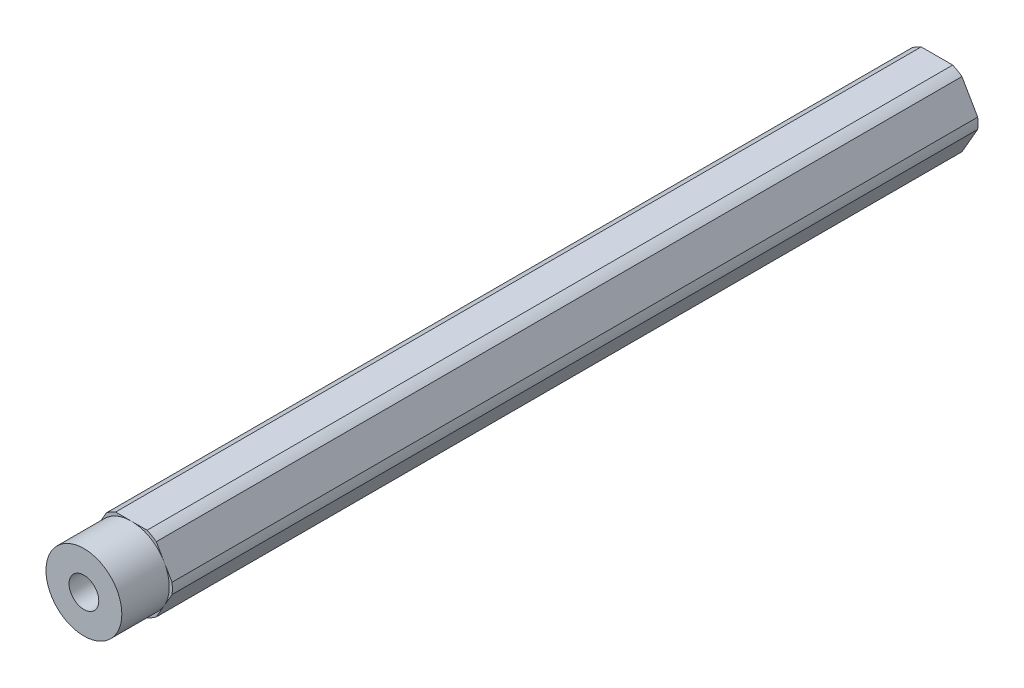
ISO-10303-21;
HEADER;
FILE_DESCRIPTION(('STEP AP214'),'2;1');
FILE_NAME('part.step','',(''),(''),'','','');
FILE_SCHEMA(('AUTOMOTIVE_DESIGN { 1 0 10303 214 1 1 1 1 }'));
ENDSEC;
DATA;
#1=APPLICATION_CONTEXT('core data for automotive mechanical design processes');
#2=APPLICATION_PROTOCOL_DEFINITION('international standard','automotive_design',2000,#1);
#3=PRODUCT_CONTEXT('',#1,'mechanical');
#4=PRODUCT('Part','Part','',(#3));
#5=PRODUCT_RELATED_PRODUCT_CATEGORY('part','',(#4));
#6=PRODUCT_DEFINITION_FORMATION('','',#4);
#7=PRODUCT_DEFINITION_CONTEXT('part definition',#1,'design');
#8=PRODUCT_DEFINITION('design','',#6,#7);
#9=PRODUCT_DEFINITION_SHAPE('','',#8);
#10=(LENGTH_UNIT() NAMED_UNIT(*) SI_UNIT(.MILLI.,.METRE.));
#11=(NAMED_UNIT(*) PLANE_ANGLE_UNIT() SI_UNIT($,.RADIAN.));
#12=(NAMED_UNIT(*) SI_UNIT($,.STERADIAN.) SOLID_ANGLE_UNIT());
#13=UNCERTAINTY_MEASURE_WITH_UNIT(LENGTH_MEASURE(1.E-05),#10,'distance_accuracy_value','');
#14=(GEOMETRIC_REPRESENTATION_CONTEXT(3) GLOBAL_UNCERTAINTY_ASSIGNED_CONTEXT((#13)) GLOBAL_UNIT_ASSIGNED_CONTEXT((#10,
#11,#12)) REPRESENTATION_CONTEXT('',''));
#15=CARTESIAN_POINT('',(0.,0.,0.));
#16=DIRECTION('',(0.,0.,1.));
#17=DIRECTION('',(1.,0.,0.));
#18=AXIS2_PLACEMENT_3D('',#15,#16,#17);
#19=CARTESIAN_POINT('',(0.,0.,67.44335));
#20=DIRECTION('',(0.,0.,1.));
#21=DIRECTION('',(1.,0.,0.));
#22=AXIS2_PLACEMENT_3D('',#19,#20,#21);
#23=PLANE('',#22);
#24=CARTESIAN_POINT('',(0.,0.,67.44335));
#25=DIRECTION('',(0.,0.,1.));
#26=DIRECTION('',(1.,0.,0.));
#27=AXIS2_PLACEMENT_3D('',#24,#25,#26);
#28=CIRCLE('',#27,6.35);
#29=CARTESIAN_POINT('',(5.49926131403118,3.175,67.44335));
#30=VERTEX_POINT('',#29);
#31=CARTESIAN_POINT('',(0.,6.35,67.44335));
#32=VERTEX_POINT('',#31);
#33=EDGE_CURVE('E54',#30,#32,#28,.T.);
#34=ORIENTED_EDGE('',*,*,#33,.F.);
#35=DIRECTION('',(-0.5,0.866025403784439,0.));
#36=VECTOR('',#35,1.);
#37=CARTESIAN_POINT('',(5.49926131403118,3.175,67.44335));
#38=LINE('',#37,#36);
#39=CARTESIAN_POINT('',(4.18177084608654,5.45696042896782,67.44335));
#40=VERTEX_POINT('',#39);
#41=EDGE_CURVE('E161',#30,#40,#38,.T.);
#42=ORIENTED_EDGE('',*,*,#41,.T.);
#43=CARTESIAN_POINT('',(0.,0.,67.44335));
#44=DIRECTION('',(0.,0.,1.));
#45=DIRECTION('',(1.,0.,0.));
#46=AXIS2_PLACEMENT_3D('',#43,#44,#45);
#47=CIRCLE('',#46,6.874999966);
#48=CARTESIAN_POINT('',(2.63498093588929,6.35,67.44335));
#49=VERTEX_POINT('',#48);
#50=EDGE_CURVE('E160',#40,#49,#47,.T.);
#51=ORIENTED_EDGE('',*,*,#50,.T.);
#52=DIRECTION('',(-1.,0.,0.));
#53=VECTOR('',#52,1.);
#54=CARTESIAN_POINT('',(0.,6.35,67.44335));
#55=LINE('',#54,#53);
#56=EDGE_CURVE('E174',#49,#32,#55,.T.);
#57=ORIENTED_EDGE('',*,*,#56,.T.);
#58=EDGE_LOOP('',(#34,#42,#51,#57));
#59=FACE_BOUND('',#58,.T.);
#60=ADVANCED_FACE('F43',(#59),#23,.T.);
#61=CARTESIAN_POINT('',(-5.49926131403118,3.175,67.44335));
#62=VERTEX_POINT('',#61);
#63=EDGE_CURVE('E11',#32,#62,#28,.T.);
#64=ORIENTED_EDGE('',*,*,#63,.F.);
#65=CARTESIAN_POINT('',(-2.63498093588929,6.35,67.44335));
#66=VERTEX_POINT('',#65);
#67=EDGE_CURVE('E186',#32,#66,#55,.T.);
#68=ORIENTED_EDGE('',*,*,#67,.T.);
#69=CARTESIAN_POINT('',(-4.18177084608654,5.45696042896783,67.44335));
#70=VERTEX_POINT('',#69);
#71=EDGE_CURVE('E187',#66,#70,#47,.T.);
#72=ORIENTED_EDGE('',*,*,#71,.T.);
#73=DIRECTION('',(-0.5,-0.866025403784438,0.));
#74=VECTOR('',#73,1.);
#75=CARTESIAN_POINT('',(-5.49926131403118,3.175,67.44335));
#76=LINE('',#75,#74);
#77=EDGE_CURVE('E189',#70,#62,#76,.T.);
#78=ORIENTED_EDGE('',*,*,#77,.T.);
#79=EDGE_LOOP('',(#64,#68,#72,#78));
#80=FACE_BOUND('',#79,.T.);
#81=ADVANCED_FACE('F310',(#80),#23,.T.);
#82=CARTESIAN_POINT('',(-5.49926131403118,-3.175,67.44335));
#83=VERTEX_POINT('',#82);
#84=EDGE_CURVE('E52',#62,#83,#28,.T.);
#85=ORIENTED_EDGE('',*,*,#84,.F.);
#86=CARTESIAN_POINT('',(-6.81675178197583,0.893039571032178,67.44335));
#87=VERTEX_POINT('',#86);
#88=EDGE_CURVE('E193',#62,#87,#76,.T.);
#89=ORIENTED_EDGE('',*,*,#88,.T.);
#90=CARTESIAN_POINT('',(-6.81675178197583,-0.893039571032174,67.44335));
#91=VERTEX_POINT('',#90);
#92=EDGE_CURVE('E192',#87,#91,#47,.T.);
#93=ORIENTED_EDGE('',*,*,#92,.T.);
#94=DIRECTION('',(0.5,-0.866025403784438,0.));
#95=VECTOR('',#94,1.);
#96=CARTESIAN_POINT('',(-5.49926131403118,-3.175,67.44335));
#97=LINE('',#96,#95);
#98=EDGE_CURVE('E194',#91,#83,#97,.T.);
#99=ORIENTED_EDGE('',*,*,#98,.T.);
#100=EDGE_LOOP('',(#85,#89,#93,#99));
#101=FACE_BOUND('',#100,.T.);
#102=ADVANCED_FACE('F298',(#101),#23,.T.);
#103=CARTESIAN_POINT('',(0.,-6.35,67.44335));
#104=VERTEX_POINT('',#103);
#105=EDGE_CURVE('E180',#83,#104,#28,.T.);
#106=ORIENTED_EDGE('',*,*,#105,.F.);
#107=CARTESIAN_POINT('',(-4.18177084608653,-5.45696042896783,67.44335));
#108=VERTEX_POINT('',#107);
#109=EDGE_CURVE('E198',#83,#108,#97,.T.);
#110=ORIENTED_EDGE('',*,*,#109,.T.);
#111=CARTESIAN_POINT('',(-2.6349809358893,-6.35,67.44335));
#112=VERTEX_POINT('',#111);
#113=EDGE_CURVE('E197',#108,#112,#47,.T.);
#114=ORIENTED_EDGE('',*,*,#113,.T.);
#115=DIRECTION('',(1.,0.,0.));
#116=VECTOR('',#115,1.);
#117=CARTESIAN_POINT('',(0.,-6.35,67.44335));
#118=LINE('',#117,#116);
#119=EDGE_CURVE('E199',#112,#104,#118,.T.);
#120=ORIENTED_EDGE('',*,*,#119,.T.);
#121=EDGE_LOOP('',(#106,#110,#114,#120));
#122=FACE_BOUND('',#121,.T.);
#123=ADVANCED_FACE('F356',(#122),#23,.T.);
#124=CARTESIAN_POINT('',(5.49926131403119,-3.175,67.44335));
#125=VERTEX_POINT('',#124);
#126=EDGE_CURVE('E69',#104,#125,#28,.T.);
#127=ORIENTED_EDGE('',*,*,#126,.F.);
#128=CARTESIAN_POINT('',(2.6349809358893,-6.35,67.44335));
#129=VERTEX_POINT('',#128);
#130=EDGE_CURVE('E203',#104,#129,#118,.T.);
#131=ORIENTED_EDGE('',*,*,#130,.T.);
#132=CARTESIAN_POINT('',(4.18177084608654,-5.45696042896782,67.44335));
#133=VERTEX_POINT('',#132);
#134=EDGE_CURVE('E202',#129,#133,#47,.T.);
#135=ORIENTED_EDGE('',*,*,#134,.T.);
#136=DIRECTION('',(0.5,0.866025403784439,0.));
#137=VECTOR('',#136,1.);
#138=CARTESIAN_POINT('',(5.49926131403119,-3.175,67.44335));
#139=LINE('',#138,#137);
#140=EDGE_CURVE('E204',#133,#125,#139,.T.);
#141=ORIENTED_EDGE('',*,*,#140,.T.);
#142=EDGE_LOOP('',(#127,#131,#135,#141));
#143=FACE_BOUND('',#142,.T.);
#144=ADVANCED_FACE('F343',(#143),#23,.T.);
#145=CARTESIAN_POINT('',(5.49926131403118,3.175,67.44335));
#146=DIRECTION('',(-0.866025403784438,-0.5,0.));
#147=DIRECTION('',(0.5,-0.866025403784439,0.));
#148=AXIS2_PLACEMENT_3D('',#145,#146,#147);
#149=PLANE('',#148);
#150=DIRECTION('',(-0.5,0.866025403784439,0.));
#151=VECTOR('',#150,1.);
#152=CARTESIAN_POINT('',(5.49926131403118,3.175,-67.44335));
#153=LINE('',#152,#151);
#154=CARTESIAN_POINT('',(6.81675178197583,0.89303957103218,-67.44335));
#155=VERTEX_POINT('',#154);
#156=CARTESIAN_POINT('',(4.18177084608654,5.45696042896782,-67.44335));
#157=VERTEX_POINT('',#156);
#158=EDGE_CURVE('E207',#155,#157,#153,.T.);
#159=ORIENTED_EDGE('',*,*,#158,.T.);
#160=DIRECTION('',(0.,0.,-1.));
#161=VECTOR('',#160,1.);
#162=CARTESIAN_POINT('',(4.18177084608654,5.45696042896782,67.44335));
#163=LINE('',#162,#161);
#164=EDGE_CURVE('E167',#40,#157,#163,.T.);
#165=ORIENTED_EDGE('',*,*,#164,.F.);
#166=ORIENTED_EDGE('',*,*,#41,.F.);
#167=CARTESIAN_POINT('',(6.81675178197583,0.89303957103218,67.44335));
#168=VERTEX_POINT('',#167);
#169=EDGE_CURVE('E152',#168,#30,#38,.T.);
#170=ORIENTED_EDGE('',*,*,#169,.F.);
#171=DIRECTION('',(0.,0.,-1.));
#172=VECTOR('',#171,1.);
#173=CARTESIAN_POINT('',(6.81675178197583,0.89303957103218,67.44335));
#174=LINE('',#173,#172);
#175=EDGE_CURVE('E225',#168,#155,#174,.T.);
#176=ORIENTED_EDGE('',*,*,#175,.T.);
#177=EDGE_LOOP('',(#159,#165,#166,#170,#176));
#178=FACE_BOUND('',#177,.T.);
#179=ADVANCED_FACE('F45',(#178),#149,.F.);
#180=CARTESIAN_POINT('',(0.,0.,67.44335));
#181=DIRECTION('',(0.,0.,-1.));
#182=DIRECTION('',(-1.,0.,0.));
#183=AXIS2_PLACEMENT_3D('',#180,#181,#182);
#184=CYLINDRICAL_SURFACE('',#183,6.874999966);
#185=CARTESIAN_POINT('',(0.,0.,-67.44335));
#186=DIRECTION('',(0.,0.,1.));
#187=DIRECTION('',(1.,0.,0.));
#188=AXIS2_PLACEMENT_3D('',#185,#186,#187);
#189=CIRCLE('',#188,6.874999966);
#190=CARTESIAN_POINT('',(2.63498093588929,6.35,-67.44335));
#191=VERTEX_POINT('',#190);
#192=EDGE_CURVE('E209',#157,#191,#189,.T.);
#193=ORIENTED_EDGE('',*,*,#192,.T.);
#194=DIRECTION('',(0.,0.,-1.));
#195=VECTOR('',#194,1.);
#196=CARTESIAN_POINT('',(2.63498093588929,6.35,67.44335));
#197=LINE('',#196,#195);
#198=EDGE_CURVE('E181',#49,#191,#197,.T.);
#199=ORIENTED_EDGE('',*,*,#198,.F.);
#200=ORIENTED_EDGE('',*,*,#50,.F.);
#201=ORIENTED_EDGE('',*,*,#164,.T.);
#202=EDGE_LOOP('',(#193,#199,#200,#201));
#203=FACE_BOUND('',#202,.T.);
#204=ADVANCED_FACE('F314',(#203),#184,.T.);
#205=CARTESIAN_POINT('',(0.,6.35,67.44335));
#206=DIRECTION('',(0.,-1.,0.));
#207=DIRECTION('',(0.,0.,-1.));
#208=AXIS2_PLACEMENT_3D('',#205,#206,#207);
#209=PLANE('',#208);
#210=DIRECTION('',(-1.,0.,0.));
#211=VECTOR('',#210,1.);
#212=CARTESIAN_POINT('',(0.,6.35,-67.44335));
#213=LINE('',#212,#211);
#214=CARTESIAN_POINT('',(-2.63498093588929,6.35,-67.44335));
#215=VERTEX_POINT('',#214);
#216=EDGE_CURVE('E211',#191,#215,#213,.T.);
#217=ORIENTED_EDGE('',*,*,#216,.T.);
#218=DIRECTION('',(0.,0.,-1.));
#219=VECTOR('',#218,1.);
#220=CARTESIAN_POINT('',(-2.63498093588929,6.35,67.44335));
#221=LINE('',#220,#219);
#222=EDGE_CURVE('E251',#66,#215,#221,.T.);
#223=ORIENTED_EDGE('',*,*,#222,.F.);
#224=ORIENTED_EDGE('',*,*,#67,.F.);
#225=ORIENTED_EDGE('',*,*,#56,.F.);
#226=ORIENTED_EDGE('',*,*,#198,.T.);
#227=EDGE_LOOP('',(#217,#223,#224,#225,#226));
#228=FACE_BOUND('',#227,.T.);
#229=ADVANCED_FACE('F258',(#228),#209,.F.);
#230=CARTESIAN_POINT('',(-4.18177084608654,5.45696042896783,-67.44335));
#231=VERTEX_POINT('',#230);
#232=EDGE_CURVE('E212',#215,#231,#189,.T.);
#233=ORIENTED_EDGE('',*,*,#232,.T.);
#234=DIRECTION('',(0.,0.,-1.));
#235=VECTOR('',#234,1.);
#236=CARTESIAN_POINT('',(-4.18177084608654,5.45696042896783,67.44335));
#237=LINE('',#236,#235);
#238=EDGE_CURVE('E248',#70,#231,#237,.T.);
#239=ORIENTED_EDGE('',*,*,#238,.F.);
#240=ORIENTED_EDGE('',*,*,#71,.F.);
#241=ORIENTED_EDGE('',*,*,#222,.T.);
#242=EDGE_LOOP('',(#233,#239,#240,#241));
#243=FACE_BOUND('',#242,.T.);
#244=ADVANCED_FACE('F311',(#243),#184,.T.);
#245=CARTESIAN_POINT('',(-5.49926131403118,3.175,67.44335));
#246=DIRECTION('',(0.866025403784438,-0.5,0.));
#247=DIRECTION('',(0.5,0.866025403784439,0.));
#248=AXIS2_PLACEMENT_3D('',#245,#246,#247);
#249=PLANE('',#248);
#250=DIRECTION('',(-0.5,-0.866025403784438,0.));
#251=VECTOR('',#250,1.);
#252=CARTESIAN_POINT('',(-5.49926131403118,3.175,-67.44335));
#253=LINE('',#252,#251);
#254=CARTESIAN_POINT('',(-6.81675178197583,0.893039571032178,-67.44335));
#255=VERTEX_POINT('',#254);
#256=EDGE_CURVE('E214',#231,#255,#253,.T.);
#257=ORIENTED_EDGE('',*,*,#256,.T.);
#258=DIRECTION('',(0.,0.,-1.));
#259=VECTOR('',#258,1.);
#260=CARTESIAN_POINT('',(-6.81675178197583,0.893039571032178,67.44335));
#261=LINE('',#260,#259);
#262=EDGE_CURVE('E245',#87,#255,#261,.T.);
#263=ORIENTED_EDGE('',*,*,#262,.F.);
#264=ORIENTED_EDGE('',*,*,#88,.F.);
#265=ORIENTED_EDGE('',*,*,#77,.F.);
#266=ORIENTED_EDGE('',*,*,#238,.T.);
#267=EDGE_LOOP('',(#257,#263,#264,#265,#266));
#268=FACE_BOUND('',#267,.T.);
#269=ADVANCED_FACE('F302',(#268),#249,.F.);
#270=CARTESIAN_POINT('',(-6.81675178197583,-0.893039571032174,-67.44335));
#271=VERTEX_POINT('',#270);
#272=EDGE_CURVE('E216',#255,#271,#189,.T.);
#273=ORIENTED_EDGE('',*,*,#272,.T.);
#274=DIRECTION('',(0.,0.,-1.));
#275=VECTOR('',#274,1.);
#276=CARTESIAN_POINT('',(-6.81675178197583,-0.893039571032174,67.44335));
#277=LINE('',#276,#275);
#278=EDGE_CURVE('E242',#91,#271,#277,.T.);
#279=ORIENTED_EDGE('',*,*,#278,.F.);
#280=ORIENTED_EDGE('',*,*,#92,.F.);
#281=ORIENTED_EDGE('',*,*,#262,.T.);
#282=EDGE_LOOP('',(#273,#279,#280,#281));
#283=FACE_BOUND('',#282,.T.);
#284=ADVANCED_FACE('F303',(#283),#184,.T.);
#285=CARTESIAN_POINT('',(-5.49926131403118,-3.175,67.44335));
#286=DIRECTION('',(0.866025403784438,0.5,0.));
#287=DIRECTION('',(-0.5,0.866025403784439,0.));
#288=AXIS2_PLACEMENT_3D('',#285,#286,#287);
#289=PLANE('',#288);
#290=DIRECTION('',(0.5,-0.866025403784438,0.));
#291=VECTOR('',#290,1.);
#292=CARTESIAN_POINT('',(-5.49926131403118,-3.175,-67.44335));
#293=LINE('',#292,#291);
#294=CARTESIAN_POINT('',(-4.18177084608653,-5.45696042896783,-67.44335));
#295=VERTEX_POINT('',#294);
#296=EDGE_CURVE('E217',#271,#295,#293,.T.);
#297=ORIENTED_EDGE('',*,*,#296,.T.);
#298=DIRECTION('',(0.,0.,-1.));
#299=VECTOR('',#298,1.);
#300=CARTESIAN_POINT('',(-4.18177084608653,-5.45696042896783,67.44335));
#301=LINE('',#300,#299);
#302=EDGE_CURVE('E239',#108,#295,#301,.T.);
#303=ORIENTED_EDGE('',*,*,#302,.F.);
#304=ORIENTED_EDGE('',*,*,#109,.F.);
#305=ORIENTED_EDGE('',*,*,#98,.F.);
#306=ORIENTED_EDGE('',*,*,#278,.T.);
#307=EDGE_LOOP('',(#297,#303,#304,#305,#306));
#308=FACE_BOUND('',#307,.T.);
#309=ADVANCED_FACE('F308',(#308),#289,.F.);
#310=CARTESIAN_POINT('',(-2.6349809358893,-6.35,-67.44335));
#311=VERTEX_POINT('',#310);
#312=EDGE_CURVE('E219',#295,#311,#189,.T.);
#313=ORIENTED_EDGE('',*,*,#312,.T.);
#314=DIRECTION('',(0.,0.,-1.));
#315=VECTOR('',#314,1.);
#316=CARTESIAN_POINT('',(-2.6349809358893,-6.35,67.44335));
#317=LINE('',#316,#315);
#318=EDGE_CURVE('E236',#112,#311,#317,.T.);
#319=ORIENTED_EDGE('',*,*,#318,.F.);
#320=ORIENTED_EDGE('',*,*,#113,.F.);
#321=ORIENTED_EDGE('',*,*,#302,.T.);
#322=EDGE_LOOP('',(#313,#319,#320,#321));
#323=FACE_BOUND('',#322,.T.);
#324=ADVANCED_FACE('F323',(#323),#184,.T.);
#325=CARTESIAN_POINT('',(0.,-6.35,67.44335));
#326=DIRECTION('',(0.,1.,0.));
#327=DIRECTION('',(0.,0.,1.));
#328=AXIS2_PLACEMENT_3D('',#325,#326,#327);
#329=PLANE('',#328);
#330=DIRECTION('',(1.,0.,0.));
#331=VECTOR('',#330,1.);
#332=CARTESIAN_POINT('',(0.,-6.35,-67.44335));
#333=LINE('',#332,#331);
#334=CARTESIAN_POINT('',(2.6349809358893,-6.35,-67.44335));
#335=VERTEX_POINT('',#334);
#336=EDGE_CURVE('E220',#311,#335,#333,.T.);
#337=ORIENTED_EDGE('',*,*,#336,.T.);
#338=DIRECTION('',(0.,0.,-1.));
#339=VECTOR('',#338,1.);
#340=CARTESIAN_POINT('',(2.6349809358893,-6.35,67.44335));
#341=LINE('',#340,#339);
#342=EDGE_CURVE('E233',#129,#335,#341,.T.);
#343=ORIENTED_EDGE('',*,*,#342,.F.);
#344=ORIENTED_EDGE('',*,*,#130,.F.);
#345=ORIENTED_EDGE('',*,*,#119,.F.);
#346=ORIENTED_EDGE('',*,*,#318,.T.);
#347=EDGE_LOOP('',(#337,#343,#344,#345,#346));
#348=FACE_BOUND('',#347,.T.);
#349=ADVANCED_FACE('F366',(#348),#329,.F.);
#350=CARTESIAN_POINT('',(4.18177084608654,-5.45696042896782,-67.44335));
#351=VERTEX_POINT('',#350);
#352=EDGE_CURVE('E222',#335,#351,#189,.T.);
#353=ORIENTED_EDGE('',*,*,#352,.T.);
#354=DIRECTION('',(0.,0.,-1.));
#355=VECTOR('',#354,1.);
#356=CARTESIAN_POINT('',(4.18177084608654,-5.45696042896782,67.44335));
#357=LINE('',#356,#355);
#358=EDGE_CURVE('E230',#133,#351,#357,.T.);
#359=ORIENTED_EDGE('',*,*,#358,.F.);
#360=ORIENTED_EDGE('',*,*,#134,.F.);
#361=ORIENTED_EDGE('',*,*,#342,.T.);
#362=EDGE_LOOP('',(#353,#359,#360,#361));
#363=FACE_BOUND('',#362,.T.);
#364=ADVANCED_FACE('F288',(#363),#184,.T.);
#365=CARTESIAN_POINT('',(5.49926131403119,-3.175,67.44335));
#366=DIRECTION('',(-0.866025403784439,0.5,0.));
#367=DIRECTION('',(-0.5,-0.866025403784439,0.));
#368=AXIS2_PLACEMENT_3D('',#365,#366,#367);
#369=PLANE('',#368);
#370=DIRECTION('',(0.5,0.866025403784439,0.));
#371=VECTOR('',#370,1.);
#372=CARTESIAN_POINT('',(5.49926131403119,-3.175,-67.44335));
#373=LINE('',#372,#371);
#374=CARTESIAN_POINT('',(6.81675178197583,-0.893039571032182,-67.44335));
#375=VERTEX_POINT('',#374);
#376=EDGE_CURVE('E223',#351,#375,#373,.T.);
#377=ORIENTED_EDGE('',*,*,#376,.T.);
#378=DIRECTION('',(0.,0.,-1.));
#379=VECTOR('',#378,1.);
#380=CARTESIAN_POINT('',(6.81675178197583,-0.893039571032182,67.44335));
#381=LINE('',#380,#379);
#382=CARTESIAN_POINT('',(6.81675178197583,-0.893039571032182,67.44335));
#383=VERTEX_POINT('',#382);
#384=EDGE_CURVE('E227',#383,#375,#381,.T.);
#385=ORIENTED_EDGE('',*,*,#384,.F.);
#386=EDGE_CURVE('E206',#125,#383,#139,.T.);
#387=ORIENTED_EDGE('',*,*,#386,.F.);
#388=ORIENTED_EDGE('',*,*,#140,.F.);
#389=ORIENTED_EDGE('',*,*,#358,.T.);
#390=EDGE_LOOP('',(#377,#385,#387,#388,#389));
#391=FACE_BOUND('',#390,.T.);
#392=ADVANCED_FACE('F285',(#391),#369,.F.);
#393=EDGE_CURVE('E170',#375,#155,#189,.T.);
#394=ORIENTED_EDGE('',*,*,#393,.T.);
#395=ORIENTED_EDGE('',*,*,#175,.F.);
#396=EDGE_CURVE('E156',#383,#168,#47,.T.);
#397=ORIENTED_EDGE('',*,*,#396,.F.);
#398=ORIENTED_EDGE('',*,*,#384,.T.);
#399=EDGE_LOOP('',(#394,#395,#397,#398));
#400=FACE_BOUND('',#399,.T.);
#401=ADVANCED_FACE('F280',(#400),#184,.T.);
#402=EDGE_CURVE('E61',#125,#30,#28,.T.);
#403=ORIENTED_EDGE('',*,*,#402,.F.);
#404=ORIENTED_EDGE('',*,*,#386,.T.);
#405=ORIENTED_EDGE('',*,*,#396,.T.);
#406=ORIENTED_EDGE('',*,*,#169,.T.);
#407=EDGE_LOOP('',(#403,#404,#405,#406));
#408=FACE_BOUND('',#407,.T.);
#409=ADVANCED_FACE('F154',(#408),#23,.T.);
#410=CARTESIAN_POINT('',(0.,0.,-67.44335));
#411=DIRECTION('',(0.,0.,1.));
#412=DIRECTION('',(1.,0.,0.));
#413=AXIS2_PLACEMENT_3D('',#410,#411,#412);
#414=PLANE('',#413);
#415=CARTESIAN_POINT('',(0.,0.,-67.44335));
#416=DIRECTION('',(0.,0.,-1.));
#417=DIRECTION('',(-1.,0.,0.));
#418=AXIS2_PLACEMENT_3D('',#415,#416,#417);
#419=CIRCLE('',#418,3.048);
#420=CARTESIAN_POINT('',(-3.048,0.,-67.44335));
#421=VERTEX_POINT('',#420);
#422=EDGE_CURVE('E557',#421,#421,#419,.T.);
#423=ORIENTED_EDGE('',*,*,#422,.F.);
#424=EDGE_LOOP('',(#423));
#425=FACE_BOUND('',#424,.T.);
#426=ORIENTED_EDGE('',*,*,#158,.F.);
#427=ORIENTED_EDGE('',*,*,#393,.F.);
#428=ORIENTED_EDGE('',*,*,#376,.F.);
#429=ORIENTED_EDGE('',*,*,#352,.F.);
#430=ORIENTED_EDGE('',*,*,#336,.F.);
#431=ORIENTED_EDGE('',*,*,#312,.F.);
#432=ORIENTED_EDGE('',*,*,#296,.F.);
#433=ORIENTED_EDGE('',*,*,#272,.F.);
#434=ORIENTED_EDGE('',*,*,#256,.F.);
#435=ORIENTED_EDGE('',*,*,#232,.F.);
#436=ORIENTED_EDGE('',*,*,#216,.F.);
#437=ORIENTED_EDGE('',*,*,#192,.F.);
#438=EDGE_LOOP('',(#426,#427,#428,#429,#430,#431,#432,#433,#434,#435,#436,#437));
#439=FACE_BOUND('',#438,.T.);
#440=ADVANCED_FACE('F265',(#425,#439),#414,.F.);
#441=CARTESIAN_POINT('',(0.,0.,75.38085));
#442=DIRECTION('',(0.,0.,1.));
#443=DIRECTION('',(1.,0.,0.));
#444=AXIS2_PLACEMENT_3D('',#441,#442,#443);
#445=PLANE('',#444);
#446=CARTESIAN_POINT('',(0.,0.,75.38085));
#447=DIRECTION('',(0.,0.,1.));
#448=DIRECTION('',(1.,0.,0.));
#449=AXIS2_PLACEMENT_3D('',#446,#447,#448);
#450=CIRCLE('',#449,6.35);
#451=CARTESIAN_POINT('',(6.35,0.,75.38085));
#452=VERTEX_POINT('',#451);
#453=EDGE_CURVE('E176',#452,#452,#450,.T.);
#454=ORIENTED_EDGE('',*,*,#453,.T.);
#455=EDGE_LOOP('',(#454));
#456=FACE_BOUND('',#455,.T.);
#457=CARTESIAN_POINT('',(0.,0.,75.38085));
#458=DIRECTION('',(0.,0.,1.));
#459=DIRECTION('',(1.,0.,0.));
#460=AXIS2_PLACEMENT_3D('',#457,#458,#459);
#461=CIRCLE('',#460,2.4892);
#462=CARTESIAN_POINT('',(2.4892,0.,75.38085));
#463=VERTEX_POINT('',#462);
#464=EDGE_CURVE('E177',#463,#463,#461,.T.);
#465=ORIENTED_EDGE('',*,*,#464,.F.);
#466=EDGE_LOOP('',(#465));
#467=FACE_BOUND('',#466,.T.);
#468=ADVANCED_FACE('F337',(#456,#467),#445,.T.);
#469=CARTESIAN_POINT('',(0.,0.,75.38085));
#470=DIRECTION('',(0.,0.,-1.));
#471=DIRECTION('',(-1.,0.,0.));
#472=AXIS2_PLACEMENT_3D('',#469,#470,#471);
#473=CYLINDRICAL_SURFACE('',#472,6.35);
#474=ORIENTED_EDGE('',*,*,#453,.F.);
#475=EDGE_LOOP('',(#474));
#476=FACE_BOUND('',#475,.T.);
#477=ORIENTED_EDGE('',*,*,#33,.T.);
#478=ORIENTED_EDGE('',*,*,#63,.T.);
#479=ORIENTED_EDGE('',*,*,#84,.T.);
#480=ORIENTED_EDGE('',*,*,#105,.T.);
#481=ORIENTED_EDGE('',*,*,#126,.T.);
#482=ORIENTED_EDGE('',*,*,#402,.T.);
#483=EDGE_LOOP('',(#477,#478,#479,#480,#481,#482));
#484=FACE_BOUND('',#483,.T.);
#485=ADVANCED_FACE('F178',(#476,#484),#473,.T.);
#486=CARTESIAN_POINT('',(0.,0.,75.38085));
#487=DIRECTION('',(0.,0.,-1.));
#488=DIRECTION('',(-1.,0.,0.));
#489=AXIS2_PLACEMENT_3D('',#486,#487,#488);
#490=CYLINDRICAL_SURFACE('',#489,2.4892);
#491=ORIENTED_EDGE('',*,*,#464,.T.);
#492=EDGE_LOOP('',(#491));
#493=FACE_BOUND('',#492,.T.);
#494=CARTESIAN_POINT('',(0.,0.,67.44335));
#495=DIRECTION('',(0.,0.,1.));
#496=DIRECTION('',(1.,0.,0.));
#497=AXIS2_PLACEMENT_3D('',#494,#495,#496);
#498=CIRCLE('',#497,2.4892);
#499=CARTESIAN_POINT('',(2.4892,0.,67.44335));
#500=VERTEX_POINT('',#499);
#501=EDGE_CURVE('E550',#500,#500,#498,.T.);
#502=ORIENTED_EDGE('',*,*,#501,.F.);
#503=EDGE_LOOP('',(#502));
#504=FACE_BOUND('',#503,.T.);
#505=ADVANCED_FACE('F341',(#493,#504),#490,.F.);
#506=CARTESIAN_POINT('',(0.,0.,67.44335));
#507=DIRECTION('',(0.,0.,1.));
#508=DIRECTION('',(1.,0.,0.));
#509=AXIS2_PLACEMENT_3D('',#506,#507,#508);
#510=CIRCLE('',#509,2.01929999999997);
#511=CARTESIAN_POINT('',(2.01929999999997,0.,67.44335));
#512=VERTEX_POINT('',#511);
#513=EDGE_CURVE('E47',#512,#512,#510,.T.);
#514=ORIENTED_EDGE('',*,*,#513,.F.);
#515=EDGE_LOOP('',(#514));
#516=FACE_BOUND('',#515,.T.);
#517=ORIENTED_EDGE('',*,*,#501,.T.);
#518=EDGE_LOOP('',(#517));
#519=FACE_BOUND('',#518,.T.);
#520=ADVANCED_FACE('F332',(#516,#519),#23,.T.);
#521=CARTESIAN_POINT('',(0.,0.,-67.44335));
#522=DIRECTION('',(0.,0.,-1.));
#523=DIRECTION('',(-1.,0.,0.));
#524=AXIS2_PLACEMENT_3D('',#521,#522,#523);
#525=CYLINDRICAL_SURFACE('',#524,2.01929999999997);
#526=ORIENTED_EDGE('',*,*,#513,.T.);
#527=EDGE_LOOP('',(#526));
#528=FACE_BOUND('',#527,.T.);
#529=CARTESIAN_POINT('',(0.,0.,-66.41465));
#530=DIRECTION('',(0.,0.,-1.));
#531=DIRECTION('',(-1.,0.,0.));
#532=AXIS2_PLACEMENT_3D('',#529,#530,#531);
#533=CIRCLE('',#532,2.01929999999998);
#534=CARTESIAN_POINT('',(-2.01929999999998,0.,-66.41465));
#535=VERTEX_POINT('',#534);
#536=EDGE_CURVE('E554',#535,#535,#533,.T.);
#537=ORIENTED_EDGE('',*,*,#536,.T.);
#538=EDGE_LOOP('',(#537));
#539=FACE_BOUND('',#538,.T.);
#540=ADVANCED_FACE('F340',(#528,#539),#525,.F.);
#541=CARTESIAN_POINT('',(0.,0.,-67.44335));
#542=DIRECTION('',(0.,0.,-1.));
#543=DIRECTION('',(-1.,0.,0.));
#544=AXIS2_PLACEMENT_3D('',#541,#542,#543);
#545=CONICAL_SURFACE('',#544,3.048,0.78539816339746);
#546=ORIENTED_EDGE('',*,*,#536,.F.);
#547=EDGE_LOOP('',(#546));
#548=FACE_BOUND('',#547,.T.);
#549=ORIENTED_EDGE('',*,*,#422,.T.);
#550=EDGE_LOOP('',(#549));
#551=FACE_BOUND('',#550,.T.);
#552=ADVANCED_FACE('F348',(#548,#551),#545,.F.);
#553=CLOSED_SHELL('',(#60,#81,#102,#123,#144,#179,#204,#229,#244,#269,#284,#309,#324,#349,#364,
#392,#401,#409,#440,#468,#485,#505,#520,#540,#552));
#554=MANIFOLD_SOLID_BREP('B2',#553);
#555=ADVANCED_BREP_SHAPE_REPRESENTATION('',(#18,#554),#14);
#556=SHAPE_DEFINITION_REPRESENTATION(#9,#555);
ENDSEC;
END-ISO-10303-21;
